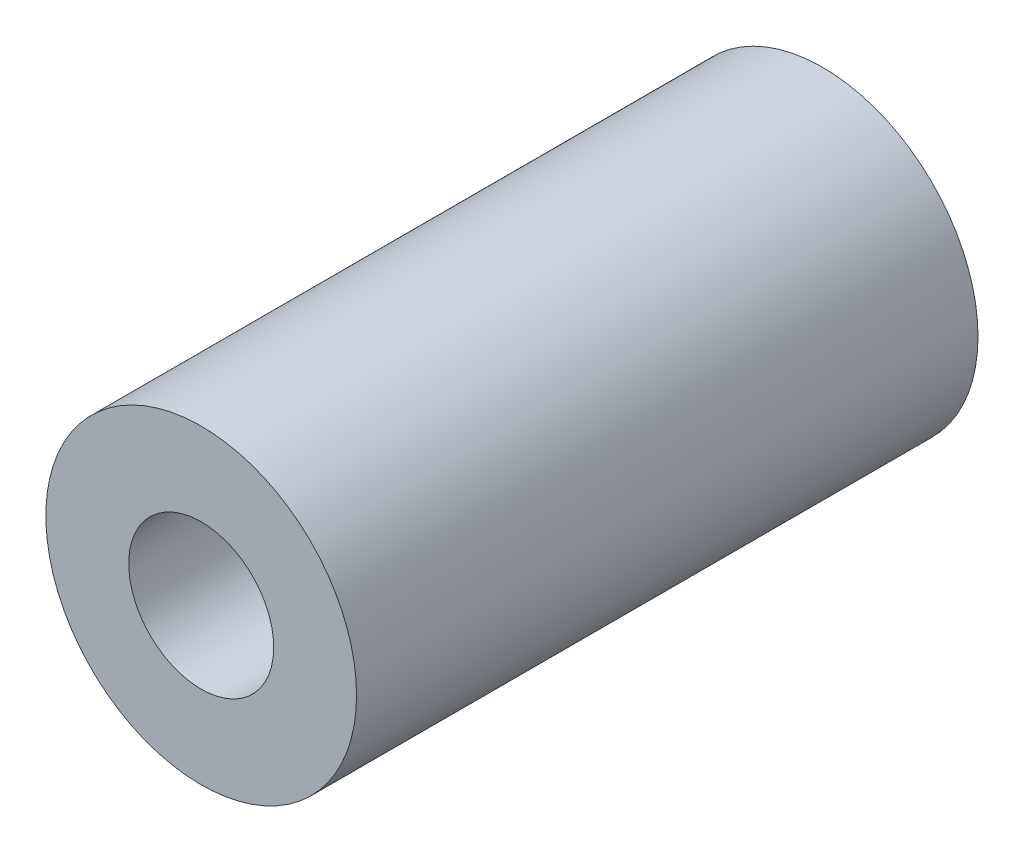
ISO-10303-21;
HEADER;
FILE_DESCRIPTION(('STEP AP214'),'2;1');
FILE_NAME('part.step','',(''),(''),'','','');
FILE_SCHEMA(('AUTOMOTIVE_DESIGN { 1 0 10303 214 1 1 1 1 }'));
ENDSEC;
DATA;
#1=APPLICATION_CONTEXT('core data for automotive mechanical design processes');
#2=APPLICATION_PROTOCOL_DEFINITION('international standard','automotive_design',2000,#1);
#3=PRODUCT_CONTEXT('',#1,'mechanical');
#4=PRODUCT('Part','Part','',(#3));
#5=PRODUCT_RELATED_PRODUCT_CATEGORY('part','',(#4));
#6=PRODUCT_DEFINITION_FORMATION('','',#4);
#7=PRODUCT_DEFINITION_CONTEXT('part definition',#1,'design');
#8=PRODUCT_DEFINITION('design','',#6,#7);
#9=PRODUCT_DEFINITION_SHAPE('','',#8);
#10=(LENGTH_UNIT() NAMED_UNIT(*) SI_UNIT(.MILLI.,.METRE.));
#11=(NAMED_UNIT(*) PLANE_ANGLE_UNIT() SI_UNIT($,.RADIAN.));
#12=(NAMED_UNIT(*) SI_UNIT($,.STERADIAN.) SOLID_ANGLE_UNIT());
#13=UNCERTAINTY_MEASURE_WITH_UNIT(LENGTH_MEASURE(1.E-05),#10,'distance_accuracy_value','');
#14=(GEOMETRIC_REPRESENTATION_CONTEXT(3) GLOBAL_UNCERTAINTY_ASSIGNED_CONTEXT((#13)) GLOBAL_UNIT_ASSIGNED_CONTEXT((#10,
#11,#12)) REPRESENTATION_CONTEXT('',''));
#15=CARTESIAN_POINT('',(0.,0.,0.));
#16=DIRECTION('',(0.,0.,1.));
#17=DIRECTION('',(1.,0.,0.));
#18=AXIS2_PLACEMENT_3D('',#15,#16,#17);
#19=CARTESIAN_POINT('',(0.,0.,15.));
#20=DIRECTION('',(0.,0.,1.));
#21=DIRECTION('',(1.,0.,0.));
#22=AXIS2_PLACEMENT_3D('',#19,#20,#21);
#23=PLANE('',#22);
#24=CARTESIAN_POINT('',(0.,0.,15.));
#25=DIRECTION('',(0.,0.,1.));
#26=DIRECTION('',(1.,0.,0.));
#27=AXIS2_PLACEMENT_3D('',#24,#25,#26);
#28=CIRCLE('',#27,3.75);
#29=CARTESIAN_POINT('',(3.75,0.,15.));
#30=VERTEX_POINT('',#29);
#31=EDGE_CURVE('E10',#30,#30,#28,.T.);
#32=ORIENTED_EDGE('',*,*,#31,.T.);
#33=EDGE_LOOP('',(#32));
#34=FACE_BOUND('',#33,.T.);
#35=CARTESIAN_POINT('',(0.,0.,15.));
#36=DIRECTION('',(0.,0.,1.));
#37=DIRECTION('',(1.,0.,0.));
#38=AXIS2_PLACEMENT_3D('',#35,#36,#37);
#39=CIRCLE('',#38,1.75);
#40=CARTESIAN_POINT('',(1.75,0.,15.));
#41=VERTEX_POINT('',#40);
#42=EDGE_CURVE('E43',#41,#41,#39,.T.);
#43=ORIENTED_EDGE('',*,*,#42,.F.);
#44=EDGE_LOOP('',(#43));
#45=FACE_BOUND('',#44,.T.);
#46=ADVANCED_FACE('F32',(#34,#45),#23,.T.);
#47=CARTESIAN_POINT('',(0.,0.,0.));
#48=DIRECTION('',(0.,0.,1.));
#49=DIRECTION('',(1.,0.,0.));
#50=AXIS2_PLACEMENT_3D('',#47,#48,#49);
#51=PLANE('',#50);
#52=CARTESIAN_POINT('',(0.,0.,0.));
#53=DIRECTION('',(0.,0.,1.));
#54=DIRECTION('',(1.,0.,0.));
#55=AXIS2_PLACEMENT_3D('',#52,#53,#54);
#56=CIRCLE('',#55,3.75);
#57=CARTESIAN_POINT('',(3.75,0.,0.));
#58=VERTEX_POINT('',#57);
#59=EDGE_CURVE('E36',#58,#58,#56,.T.);
#60=ORIENTED_EDGE('',*,*,#59,.F.);
#61=EDGE_LOOP('',(#60));
#62=FACE_BOUND('',#61,.T.);
#63=CARTESIAN_POINT('',(0.,0.,0.));
#64=DIRECTION('',(0.,0.,1.));
#65=DIRECTION('',(1.,0.,0.));
#66=AXIS2_PLACEMENT_3D('',#63,#64,#65);
#67=CIRCLE('',#66,1.75);
#68=CARTESIAN_POINT('',(1.75,0.,0.));
#69=VERTEX_POINT('',#68);
#70=EDGE_CURVE('E45',#69,#69,#67,.T.);
#71=ORIENTED_EDGE('',*,*,#70,.T.);
#72=EDGE_LOOP('',(#71));
#73=FACE_BOUND('',#72,.T.);
#74=ADVANCED_FACE('F55',(#62,#73),#51,.F.);
#75=CARTESIAN_POINT('',(0.,0.,15.));
#76=DIRECTION('',(0.,0.,-1.));
#77=DIRECTION('',(-1.,0.,0.));
#78=AXIS2_PLACEMENT_3D('',#75,#76,#77);
#79=CYLINDRICAL_SURFACE('',#78,3.75);
#80=ORIENTED_EDGE('',*,*,#31,.F.);
#81=EDGE_LOOP('',(#80));
#82=FACE_BOUND('',#81,.T.);
#83=ORIENTED_EDGE('',*,*,#59,.T.);
#84=EDGE_LOOP('',(#83));
#85=FACE_BOUND('',#84,.T.);
#86=ADVANCED_FACE('F34',(#82,#85),#79,.T.);
#87=CARTESIAN_POINT('',(0.,0.,15.));
#88=DIRECTION('',(0.,0.,-1.));
#89=DIRECTION('',(-1.,0.,0.));
#90=AXIS2_PLACEMENT_3D('',#87,#88,#89);
#91=CYLINDRICAL_SURFACE('',#90,1.75);
#92=ORIENTED_EDGE('',*,*,#42,.T.);
#93=EDGE_LOOP('',(#92));
#94=FACE_BOUND('',#93,.T.);
#95=ORIENTED_EDGE('',*,*,#70,.F.);
#96=EDGE_LOOP('',(#95));
#97=FACE_BOUND('',#96,.T.);
#98=ADVANCED_FACE('F51',(#94,#97),#91,.F.);
#99=CLOSED_SHELL('',(#46,#74,#86,#98));
#100=MANIFOLD_SOLID_BREP('B2',#99);
#101=ADVANCED_BREP_SHAPE_REPRESENTATION('',(#18,#100),#14);
#102=SHAPE_DEFINITION_REPRESENTATION(#9,#101);
ENDSEC;
END-ISO-10303-21;
